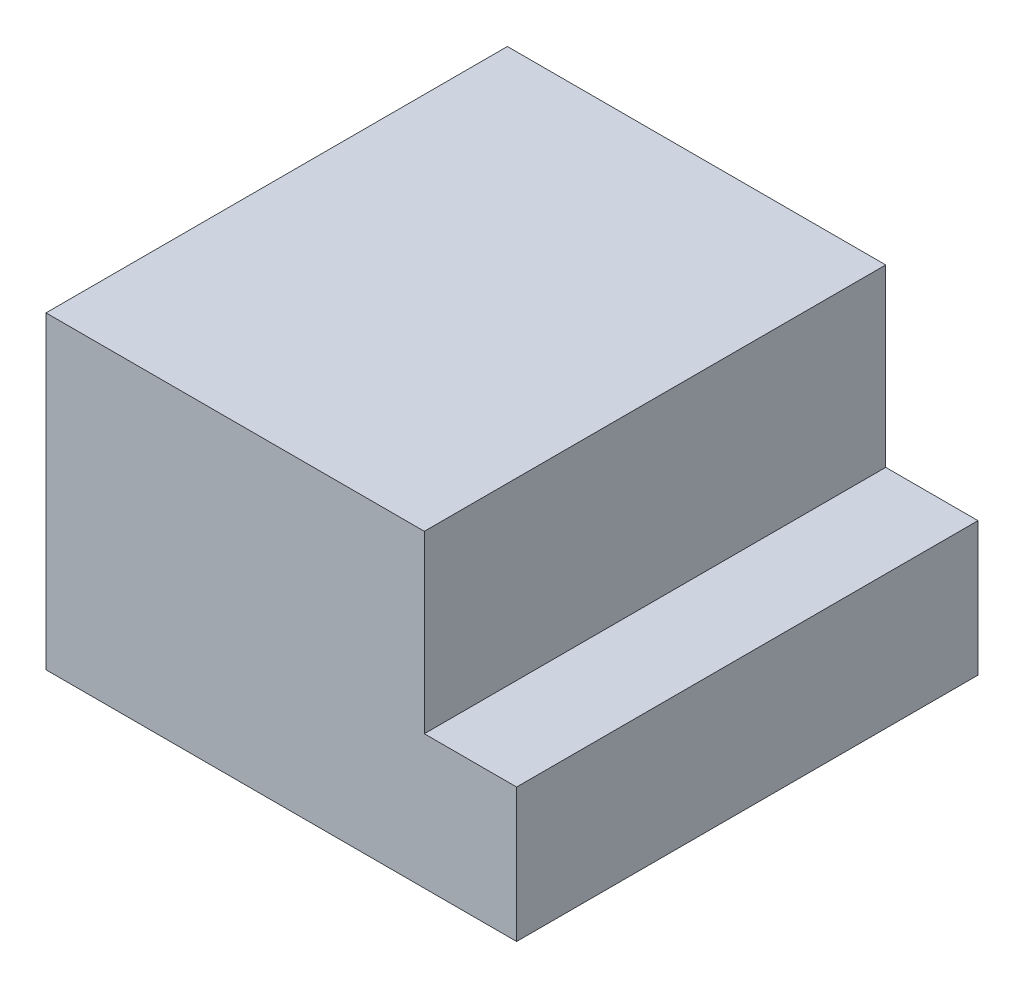
ISO-10303-21;
HEADER;
FILE_DESCRIPTION(('STEP AP214'),'2;1');
FILE_NAME('part.step','',(''),(''),'','','');
FILE_SCHEMA(('AUTOMOTIVE_DESIGN { 1 0 10303 214 1 1 1 1 }'));
ENDSEC;
DATA;
#1=APPLICATION_CONTEXT('core data for automotive mechanical design processes');
#2=APPLICATION_PROTOCOL_DEFINITION('international standard','automotive_design',2000,#1);
#3=PRODUCT_CONTEXT('',#1,'mechanical');
#4=PRODUCT('Part','Part','',(#3));
#5=PRODUCT_RELATED_PRODUCT_CATEGORY('part','',(#4));
#6=PRODUCT_DEFINITION_FORMATION('','',#4);
#7=PRODUCT_DEFINITION_CONTEXT('part definition',#1,'design');
#8=PRODUCT_DEFINITION('design','',#6,#7);
#9=PRODUCT_DEFINITION_SHAPE('','',#8);
#10=(LENGTH_UNIT() NAMED_UNIT(*) SI_UNIT(.MILLI.,.METRE.));
#11=(NAMED_UNIT(*) PLANE_ANGLE_UNIT() SI_UNIT($,.RADIAN.));
#12=(NAMED_UNIT(*) SI_UNIT($,.STERADIAN.) SOLID_ANGLE_UNIT());
#13=UNCERTAINTY_MEASURE_WITH_UNIT(LENGTH_MEASURE(1.E-05),#10,'distance_accuracy_value','');
#14=(GEOMETRIC_REPRESENTATION_CONTEXT(3) GLOBAL_UNCERTAINTY_ASSIGNED_CONTEXT((#13)) GLOBAL_UNIT_ASSIGNED_CONTEXT((#10,
#11,#12)) REPRESENTATION_CONTEXT('',''));
#15=CARTESIAN_POINT('',(0.,0.,0.));
#16=DIRECTION('',(0.,0.,1.));
#17=DIRECTION('',(1.,0.,0.));
#18=AXIS2_PLACEMENT_3D('',#15,#16,#17);
#19=CARTESIAN_POINT('',(41.,0.,0.));
#20=DIRECTION('',(-1.,0.,0.));
#21=DIRECTION('',(0.,0.,1.));
#22=AXIS2_PLACEMENT_3D('',#19,#20,#21);
#23=PLANE('',#22);
#24=DIRECTION('',(0.,0.,1.));
#25=VECTOR('',#24,1.);
#26=CARTESIAN_POINT('',(41.,-4.5,50.));
#27=LINE('',#26,#25);
#28=CARTESIAN_POINT('',(41.,-4.5,-50.));
#29=VERTEX_POINT('',#28);
#30=CARTESIAN_POINT('',(41.,-4.5,50.));
#31=VERTEX_POINT('',#30);
#32=EDGE_CURVE('E52',#29,#31,#27,.T.);
#33=ORIENTED_EDGE('',*,*,#32,.F.);
#34=DIRECTION('',(0.,1.,0.));
#35=VECTOR('',#34,1.);
#36=CARTESIAN_POINT('',(41.,-33.5,-50.));
#37=LINE('',#36,#35);
#38=CARTESIAN_POINT('',(41.,33.5,-50.));
#39=VERTEX_POINT('',#38);
#40=EDGE_CURVE('E90',#29,#39,#37,.T.);
#41=ORIENTED_EDGE('',*,*,#40,.T.);
#42=DIRECTION('',(0.,0.,1.));
#43=VECTOR('',#42,1.);
#44=CARTESIAN_POINT('',(41.,33.5,50.));
#45=LINE('',#44,#43);
#46=CARTESIAN_POINT('',(41.,33.5,50.));
#47=VERTEX_POINT('',#46);
#48=EDGE_CURVE('E58',#39,#47,#45,.T.);
#49=ORIENTED_EDGE('',*,*,#48,.T.);
#50=DIRECTION('',(0.,-1.,0.));
#51=VECTOR('',#50,1.);
#52=CARTESIAN_POINT('',(41.,-33.5,50.));
#53=LINE('',#52,#51);
#54=EDGE_CURVE('E101',#47,#31,#53,.T.);
#55=ORIENTED_EDGE('',*,*,#54,.T.);
#56=EDGE_LOOP('',(#33,#41,#49,#55));
#57=FACE_BOUND('',#56,.T.);
#58=ADVANCED_FACE('F35',(#57),#23,.F.);
#59=CARTESIAN_POINT('',(41.,-33.5,-50.));
#60=DIRECTION('',(0.,0.,1.));
#61=DIRECTION('',(1.,0.,0.));
#62=AXIS2_PLACEMENT_3D('',#59,#60,#61);
#63=PLANE('',#62);
#64=DIRECTION('',(0.,1.,0.));
#65=VECTOR('',#64,1.);
#66=CARTESIAN_POINT('',(-41.,-33.5,-50.));
#67=LINE('',#66,#65);
#68=CARTESIAN_POINT('',(-41.,-33.5,-50.));
#69=VERTEX_POINT('',#68);
#70=CARTESIAN_POINT('',(-41.,33.5,-50.));
#71=VERTEX_POINT('',#70);
#72=EDGE_CURVE('E97',#69,#71,#67,.T.);
#73=ORIENTED_EDGE('',*,*,#72,.T.);
#74=DIRECTION('',(-1.,0.,0.));
#75=VECTOR('',#74,1.);
#76=CARTESIAN_POINT('',(41.,33.5,-50.));
#77=LINE('',#76,#75);
#78=EDGE_CURVE('E11',#39,#71,#77,.T.);
#79=ORIENTED_EDGE('',*,*,#78,.F.);
#80=ORIENTED_EDGE('',*,*,#40,.F.);
#81=DIRECTION('',(-1.,0.,0.));
#82=VECTOR('',#81,1.);
#83=CARTESIAN_POINT('',(61.,-4.5,-50.));
#84=LINE('',#83,#82);
#85=CARTESIAN_POINT('',(61.,-4.5,-50.));
#86=VERTEX_POINT('',#85);
#87=EDGE_CURVE('E105',#86,#29,#84,.T.);
#88=ORIENTED_EDGE('',*,*,#87,.F.);
#89=DIRECTION('',(0.,1.,0.));
#90=VECTOR('',#89,1.);
#91=CARTESIAN_POINT('',(61.,-4.5,-50.));
#92=LINE('',#91,#90);
#93=CARTESIAN_POINT('',(61.,-33.5,-50.));
#94=VERTEX_POINT('',#93);
#95=EDGE_CURVE('E100',#94,#86,#92,.T.);
#96=ORIENTED_EDGE('',*,*,#95,.F.);
#97=DIRECTION('',(-1.,0.,0.));
#98=VECTOR('',#97,1.);
#99=CARTESIAN_POINT('',(41.,-33.5,-50.));
#100=LINE('',#99,#98);
#101=EDGE_CURVE('E83',#94,#69,#100,.T.);
#102=ORIENTED_EDGE('',*,*,#101,.T.);
#103=EDGE_LOOP('',(#73,#79,#80,#88,#96,#102));
#104=FACE_BOUND('',#103,.T.);
#105=ADVANCED_FACE('F37',(#104),#63,.F.);
#106=CARTESIAN_POINT('',(41.,33.5,50.));
#107=DIRECTION('',(0.,-1.,0.));
#108=DIRECTION('',(0.,0.,-1.));
#109=AXIS2_PLACEMENT_3D('',#106,#107,#108);
#110=PLANE('',#109);
#111=DIRECTION('',(0.,0.,1.));
#112=VECTOR('',#111,1.);
#113=CARTESIAN_POINT('',(-41.,33.5,50.));
#114=LINE('',#113,#112);
#115=CARTESIAN_POINT('',(-41.,33.5,50.));
#116=VERTEX_POINT('',#115);
#117=EDGE_CURVE('E104',#71,#116,#114,.T.);
#118=ORIENTED_EDGE('',*,*,#117,.T.);
#119=DIRECTION('',(-1.,0.,0.));
#120=VECTOR('',#119,1.);
#121=CARTESIAN_POINT('',(41.,33.5,50.));
#122=LINE('',#121,#120);
#123=EDGE_CURVE('E44',#47,#116,#122,.T.);
#124=ORIENTED_EDGE('',*,*,#123,.F.);
#125=ORIENTED_EDGE('',*,*,#48,.F.);
#126=ORIENTED_EDGE('',*,*,#78,.T.);
#127=EDGE_LOOP('',(#118,#124,#125,#126));
#128=FACE_BOUND('',#127,.T.);
#129=ADVANCED_FACE('F155',(#128),#110,.F.);
#130=CARTESIAN_POINT('',(41.,-33.5,50.));
#131=DIRECTION('',(0.,0.,-1.));
#132=DIRECTION('',(-1.,0.,0.));
#133=AXIS2_PLACEMENT_3D('',#130,#131,#132);
#134=PLANE('',#133);
#135=DIRECTION('',(0.,-1.,0.));
#136=VECTOR('',#135,1.);
#137=CARTESIAN_POINT('',(-41.,-33.5,50.));
#138=LINE('',#137,#136);
#139=CARTESIAN_POINT('',(-41.,-33.5,50.));
#140=VERTEX_POINT('',#139);
#141=EDGE_CURVE('E91',#116,#140,#138,.T.);
#142=ORIENTED_EDGE('',*,*,#141,.T.);
#143=DIRECTION('',(-1.,0.,0.));
#144=VECTOR('',#143,1.);
#145=CARTESIAN_POINT('',(41.,-33.5,50.));
#146=LINE('',#145,#144);
#147=CARTESIAN_POINT('',(61.,-33.5,50.));
#148=VERTEX_POINT('',#147);
#149=EDGE_CURVE('E86',#148,#140,#146,.T.);
#150=ORIENTED_EDGE('',*,*,#149,.F.);
#151=DIRECTION('',(0.,-1.,0.));
#152=VECTOR('',#151,1.);
#153=CARTESIAN_POINT('',(61.,-33.5,50.));
#154=LINE('',#153,#152);
#155=CARTESIAN_POINT('',(61.,-4.5,50.));
#156=VERTEX_POINT('',#155);
#157=EDGE_CURVE('E135',#156,#148,#154,.T.);
#158=ORIENTED_EDGE('',*,*,#157,.F.);
#159=DIRECTION('',(-1.,0.,0.));
#160=VECTOR('',#159,1.);
#161=CARTESIAN_POINT('',(61.,-4.5,50.));
#162=LINE('',#161,#160);
#163=EDGE_CURVE('E109',#156,#31,#162,.T.);
#164=ORIENTED_EDGE('',*,*,#163,.T.);
#165=ORIENTED_EDGE('',*,*,#54,.F.);
#166=ORIENTED_EDGE('',*,*,#123,.T.);
#167=EDGE_LOOP('',(#142,#150,#158,#164,#165,#166));
#168=FACE_BOUND('',#167,.T.);
#169=ADVANCED_FACE('F136',(#168),#134,.F.);
#170=CARTESIAN_POINT('',(41.,-33.5,50.));
#171=DIRECTION('',(0.,1.,0.));
#172=DIRECTION('',(0.,0.,1.));
#173=AXIS2_PLACEMENT_3D('',#170,#171,#172);
#174=PLANE('',#173);
#175=DIRECTION('',(0.,0.,-1.));
#176=VECTOR('',#175,1.);
#177=CARTESIAN_POINT('',(-41.,-33.5,50.));
#178=LINE('',#177,#176);
#179=EDGE_CURVE('E78',#140,#69,#178,.T.);
#180=ORIENTED_EDGE('',*,*,#179,.T.);
#181=ORIENTED_EDGE('',*,*,#101,.F.);
#182=DIRECTION('',(0.,0.,-1.));
#183=VECTOR('',#182,1.);
#184=CARTESIAN_POINT('',(61.,-33.5,50.));
#185=LINE('',#184,#183);
#186=EDGE_CURVE('E144',#148,#94,#185,.T.);
#187=ORIENTED_EDGE('',*,*,#186,.F.);
#188=ORIENTED_EDGE('',*,*,#149,.T.);
#189=EDGE_LOOP('',(#180,#181,#187,#188));
#190=FACE_BOUND('',#189,.T.);
#191=ADVANCED_FACE('F80',(#190),#174,.F.);
#192=CARTESIAN_POINT('',(-41.,0.,0.));
#193=DIRECTION('',(-1.,0.,0.));
#194=DIRECTION('',(0.,0.,1.));
#195=AXIS2_PLACEMENT_3D('',#192,#193,#194);
#196=PLANE('',#195);
#197=ORIENTED_EDGE('',*,*,#72,.F.);
#198=ORIENTED_EDGE('',*,*,#179,.F.);
#199=ORIENTED_EDGE('',*,*,#141,.F.);
#200=ORIENTED_EDGE('',*,*,#117,.F.);
#201=EDGE_LOOP('',(#197,#198,#199,#200));
#202=FACE_BOUND('',#201,.T.);
#203=ADVANCED_FACE('F103',(#202),#196,.T.);
#204=CARTESIAN_POINT('',(61.,-4.5,50.));
#205=DIRECTION('',(0.,-1.,0.));
#206=DIRECTION('',(0.,0.,-1.));
#207=AXIS2_PLACEMENT_3D('',#204,#205,#206);
#208=PLANE('',#207);
#209=ORIENTED_EDGE('',*,*,#32,.T.);
#210=ORIENTED_EDGE('',*,*,#163,.F.);
#211=DIRECTION('',(0.,0.,1.));
#212=VECTOR('',#211,1.);
#213=CARTESIAN_POINT('',(61.,-4.5,50.));
#214=LINE('',#213,#212);
#215=EDGE_CURVE('E138',#86,#156,#214,.T.);
#216=ORIENTED_EDGE('',*,*,#215,.F.);
#217=ORIENTED_EDGE('',*,*,#87,.T.);
#218=EDGE_LOOP('',(#209,#210,#216,#217));
#219=FACE_BOUND('',#218,.T.);
#220=ADVANCED_FACE('F132',(#219),#208,.F.);
#221=CARTESIAN_POINT('',(61.,0.,0.));
#222=DIRECTION('',(-1.,0.,0.));
#223=DIRECTION('',(0.,0.,1.));
#224=AXIS2_PLACEMENT_3D('',#221,#222,#223);
#225=PLANE('',#224);
#226=ORIENTED_EDGE('',*,*,#157,.T.);
#227=ORIENTED_EDGE('',*,*,#186,.T.);
#228=ORIENTED_EDGE('',*,*,#95,.T.);
#229=ORIENTED_EDGE('',*,*,#215,.T.);
#230=EDGE_LOOP('',(#226,#227,#228,#229));
#231=FACE_BOUND('',#230,.T.);
#232=ADVANCED_FACE('F148',(#231),#225,.F.);
#233=CLOSED_SHELL('',(#58,#105,#129,#169,#191,#203,#220,#232));
#234=MANIFOLD_SOLID_BREP('B2',#233);
#235=ADVANCED_BREP_SHAPE_REPRESENTATION('',(#18,#234),#14);
#236=SHAPE_DEFINITION_REPRESENTATION(#9,#235);
ENDSEC;
END-ISO-10303-21;
